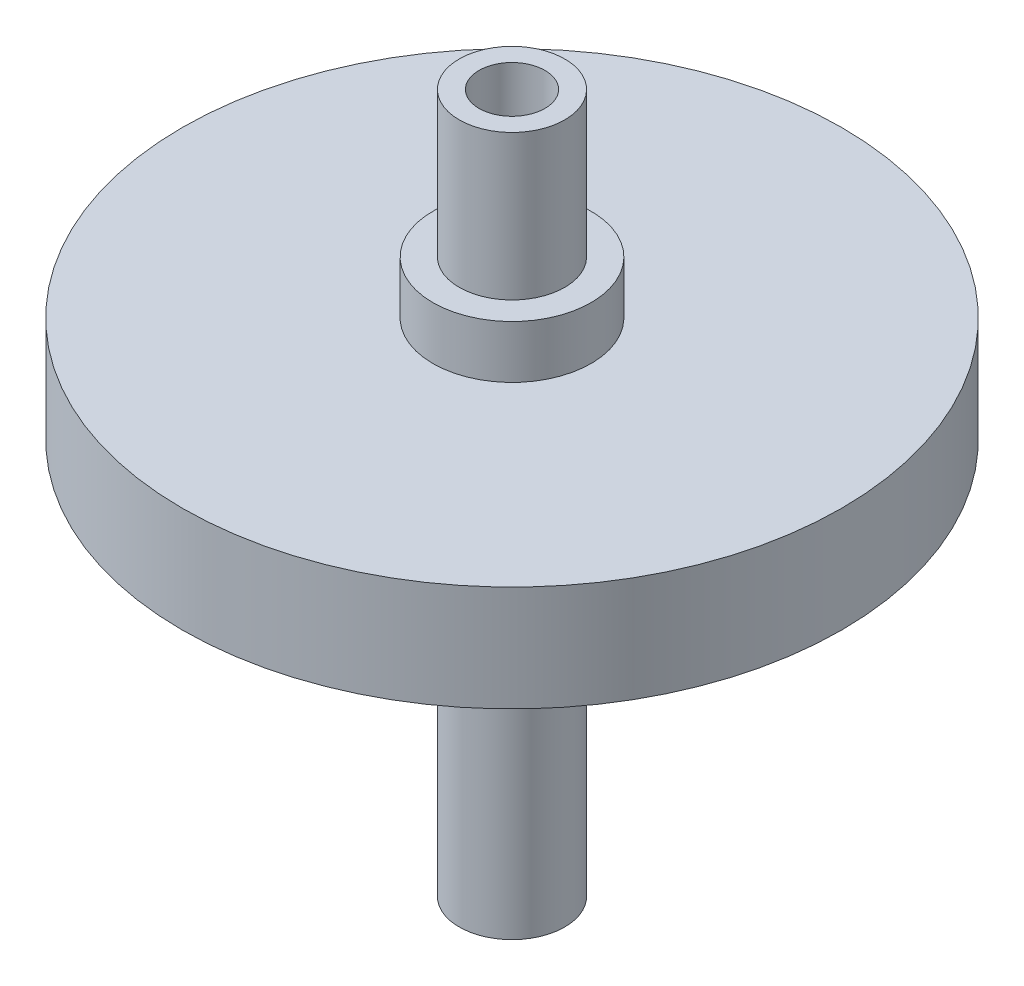
ISO-10303-21;
HEADER;
FILE_DESCRIPTION(('STEP AP214'),'2;1');
FILE_NAME('part.step','',(''),(''),'','','');
FILE_SCHEMA(('AUTOMOTIVE_DESIGN { 1 0 10303 214 1 1 1 1 }'));
ENDSEC;
DATA;
#1=APPLICATION_CONTEXT('core data for automotive mechanical design processes');
#2=APPLICATION_PROTOCOL_DEFINITION('international standard','automotive_design',2000,#1);
#3=PRODUCT_CONTEXT('',#1,'mechanical');
#4=PRODUCT('Part','Part','',(#3));
#5=PRODUCT_RELATED_PRODUCT_CATEGORY('part','',(#4));
#6=PRODUCT_DEFINITION_FORMATION('','',#4);
#7=PRODUCT_DEFINITION_CONTEXT('part definition',#1,'design');
#8=PRODUCT_DEFINITION('design','',#6,#7);
#9=PRODUCT_DEFINITION_SHAPE('','',#8);
#10=(LENGTH_UNIT() NAMED_UNIT(*) SI_UNIT(.MILLI.,.METRE.));
#11=(NAMED_UNIT(*) PLANE_ANGLE_UNIT() SI_UNIT($,.RADIAN.));
#12=(NAMED_UNIT(*) SI_UNIT($,.STERADIAN.) SOLID_ANGLE_UNIT());
#13=UNCERTAINTY_MEASURE_WITH_UNIT(LENGTH_MEASURE(1.E-05),#10,'distance_accuracy_value','');
#14=(GEOMETRIC_REPRESENTATION_CONTEXT(3) GLOBAL_UNCERTAINTY_ASSIGNED_CONTEXT((#13)) GLOBAL_UNIT_ASSIGNED_CONTEXT((#10,
#11,#12)) REPRESENTATION_CONTEXT('',''));
#15=CARTESIAN_POINT('',(0.,0.,0.));
#16=DIRECTION('',(0.,0.,1.));
#17=DIRECTION('',(1.,0.,0.));
#18=AXIS2_PLACEMENT_3D('',#15,#16,#17);
#19=CARTESIAN_POINT('',(0.,8.,0.));
#20=DIRECTION('',(0.,-1.,0.));
#21=DIRECTION('',(0.,0.,-1.));
#22=AXIS2_PLACEMENT_3D('',#19,#20,#21);
#23=CYLINDRICAL_SURFACE('',#22,25.);
#24=CARTESIAN_POINT('',(0.,8.,0.));
#25=DIRECTION('',(0.,1.,0.));
#26=DIRECTION('',(0.,0.,1.));
#27=AXIS2_PLACEMENT_3D('',#24,#25,#26);
#28=CIRCLE('',#27,25.);
#29=CARTESIAN_POINT('',(0.,8.,25.));
#30=VERTEX_POINT('',#29);
#31=EDGE_CURVE('E76',#30,#30,#28,.T.);
#32=ORIENTED_EDGE('',*,*,#31,.F.);
#33=EDGE_LOOP('',(#32));
#34=FACE_BOUND('',#33,.T.);
#35=CARTESIAN_POINT('',(0.,0.,0.));
#36=DIRECTION('',(0.,1.,0.));
#37=DIRECTION('',(0.,0.,1.));
#38=AXIS2_PLACEMENT_3D('',#35,#36,#37);
#39=CIRCLE('',#38,25.);
#40=CARTESIAN_POINT('',(0.,0.,25.));
#41=VERTEX_POINT('',#40);
#42=EDGE_CURVE('E75',#41,#41,#39,.T.);
#43=ORIENTED_EDGE('',*,*,#42,.T.);
#44=EDGE_LOOP('',(#43));
#45=FACE_BOUND('',#44,.T.);
#46=ADVANCED_FACE('F35',(#34,#45),#23,.T.);
#47=CARTESIAN_POINT('',(0.,8.,0.));
#48=DIRECTION('',(0.,1.,0.));
#49=DIRECTION('',(0.,0.,1.));
#50=AXIS2_PLACEMENT_3D('',#47,#48,#49);
#51=PLANE('',#50);
#52=CARTESIAN_POINT('',(0.,8.,0.));
#53=DIRECTION('',(0.,1.,0.));
#54=DIRECTION('',(0.,0.,1.));
#55=AXIS2_PLACEMENT_3D('',#52,#53,#54);
#56=CIRCLE('',#55,6.);
#57=CARTESIAN_POINT('',(0.,8.,6.));
#58=VERTEX_POINT('',#57);
#59=EDGE_CURVE('E51',#58,#58,#56,.T.);
#60=ORIENTED_EDGE('',*,*,#59,.F.);
#61=EDGE_LOOP('',(#60));
#62=FACE_BOUND('',#61,.T.);
#63=ORIENTED_EDGE('',*,*,#31,.T.);
#64=EDGE_LOOP('',(#63));
#65=FACE_BOUND('',#64,.T.);
#66=ADVANCED_FACE('F113',(#62,#65),#51,.T.);
#67=CARTESIAN_POINT('',(0.,0.,0.));
#68=DIRECTION('',(0.,1.,0.));
#69=DIRECTION('',(0.,0.,1.));
#70=AXIS2_PLACEMENT_3D('',#67,#68,#69);
#71=PLANE('',#70);
#72=CARTESIAN_POINT('',(0.,0.,0.));
#73=DIRECTION('',(0.,1.,0.));
#74=DIRECTION('',(0.,0.,1.));
#75=AXIS2_PLACEMENT_3D('',#72,#73,#74);
#76=CIRCLE('',#75,6.);
#77=CARTESIAN_POINT('',(0.,0.,6.));
#78=VERTEX_POINT('',#77);
#79=EDGE_CURVE('E43',#78,#78,#76,.F.);
#80=ORIENTED_EDGE('',*,*,#79,.F.);
#81=EDGE_LOOP('',(#80));
#82=FACE_BOUND('',#81,.T.);
#83=ORIENTED_EDGE('',*,*,#42,.F.);
#84=EDGE_LOOP('',(#83));
#85=FACE_BOUND('',#84,.T.);
#86=ADVANCED_FACE('F110',(#82,#85),#71,.F.);
#87=CARTESIAN_POINT('',(0.,-4.,0.));
#88=DIRECTION('',(0.,-1.,0.));
#89=DIRECTION('',(0.,0.,-1.));
#90=AXIS2_PLACEMENT_3D('',#87,#88,#89);
#91=PLANE('',#90);
#92=CARTESIAN_POINT('',(0.,-4.,0.));
#93=DIRECTION('',(0.,-1.,0.));
#94=DIRECTION('',(0.,0.,-1.));
#95=AXIS2_PLACEMENT_3D('',#92,#93,#94);
#96=CIRCLE('',#95,6.);
#97=CARTESIAN_POINT('',(0.,-4.,-6.));
#98=VERTEX_POINT('',#97);
#99=EDGE_CURVE('E56',#98,#98,#96,.T.);
#100=ORIENTED_EDGE('',*,*,#99,.T.);
#101=EDGE_LOOP('',(#100));
#102=FACE_BOUND('',#101,.T.);
#103=CARTESIAN_POINT('',(0.,-4.,0.));
#104=DIRECTION('',(0.,-1.,0.));
#105=DIRECTION('',(0.,0.,-1.));
#106=AXIS2_PLACEMENT_3D('',#103,#104,#105);
#107=CIRCLE('',#106,4.);
#108=CARTESIAN_POINT('',(0.,-4.,-4.));
#109=VERTEX_POINT('',#108);
#110=EDGE_CURVE('E60',#109,#109,#107,.T.);
#111=ORIENTED_EDGE('',*,*,#110,.F.);
#112=EDGE_LOOP('',(#111));
#113=FACE_BOUND('',#112,.T.);
#114=ADVANCED_FACE('F93',(#102,#113),#91,.T.);
#115=CARTESIAN_POINT('',(0.,-4.,0.));
#116=DIRECTION('',(0.,1.,0.));
#117=DIRECTION('',(0.,0.,1.));
#118=AXIS2_PLACEMENT_3D('',#115,#116,#117);
#119=CYLINDRICAL_SURFACE('',#118,6.);
#120=ORIENTED_EDGE('',*,*,#99,.F.);
#121=EDGE_LOOP('',(#120));
#122=FACE_BOUND('',#121,.T.);
#123=ORIENTED_EDGE('',*,*,#79,.T.);
#124=EDGE_LOOP('',(#123));
#125=FACE_BOUND('',#124,.T.);
#126=ADVANCED_FACE('F109',(#122,#125),#119,.T.);
#127=CARTESIAN_POINT('',(0.,-30.,0.));
#128=DIRECTION('',(0.,1.,0.));
#129=DIRECTION('',(0.,0.,1.));
#130=AXIS2_PLACEMENT_3D('',#127,#128,#129);
#131=CYLINDRICAL_SURFACE('',#130,4.);
#132=ORIENTED_EDGE('',*,*,#110,.T.);
#133=EDGE_LOOP('',(#132));
#134=FACE_BOUND('',#133,.T.);
#135=CARTESIAN_POINT('',(0.,-30.,0.));
#136=DIRECTION('',(0.,-1.,0.));
#137=DIRECTION('',(0.,0.,-1.));
#138=AXIS2_PLACEMENT_3D('',#135,#136,#137);
#139=CIRCLE('',#138,4.);
#140=CARTESIAN_POINT('',(0.,-30.,-4.));
#141=VERTEX_POINT('',#140);
#142=EDGE_CURVE('E69',#141,#141,#139,.T.);
#143=ORIENTED_EDGE('',*,*,#142,.F.);
#144=EDGE_LOOP('',(#143));
#145=FACE_BOUND('',#144,.T.);
#146=ADVANCED_FACE('F138',(#134,#145),#131,.T.);
#147=CARTESIAN_POINT('',(0.,-30.,0.));
#148=DIRECTION('',(0.,-1.,0.));
#149=DIRECTION('',(0.,0.,-1.));
#150=AXIS2_PLACEMENT_3D('',#147,#148,#149);
#151=PLANE('',#150);
#152=CARTESIAN_POINT('',(0.,-30.,0.));
#153=DIRECTION('',(0.,1.,0.));
#154=DIRECTION('',(0.,0.,1.));
#155=AXIS2_PLACEMENT_3D('',#152,#153,#154);
#156=CIRCLE('',#155,2.5);
#157=CARTESIAN_POINT('',(0.,-30.,2.5));
#158=VERTEX_POINT('',#157);
#159=EDGE_CURVE('E63',#158,#158,#156,.T.);
#160=ORIENTED_EDGE('',*,*,#159,.T.);
#161=EDGE_LOOP('',(#160));
#162=FACE_BOUND('',#161,.T.);
#163=ORIENTED_EDGE('',*,*,#142,.T.);
#164=EDGE_LOOP('',(#163));
#165=FACE_BOUND('',#164,.T.);
#166=ADVANCED_FACE('F102',(#162,#165),#151,.T.);
#167=CARTESIAN_POINT('',(0.,-30.,0.));
#168=DIRECTION('',(0.,1.,0.));
#169=DIRECTION('',(0.,0.,1.));
#170=AXIS2_PLACEMENT_3D('',#167,#168,#169);
#171=CYLINDRICAL_SURFACE('',#170,2.5);
#172=CARTESIAN_POINT('',(0.,-4.,0.));
#173=DIRECTION('',(0.,-1.,0.));
#174=DIRECTION('',(0.,0.,-1.));
#175=AXIS2_PLACEMENT_3D('',#172,#173,#174);
#176=CIRCLE('',#175,2.5);
#177=CARTESIAN_POINT('',(0.,-4.,-2.5));
#178=VERTEX_POINT('',#177);
#179=EDGE_CURVE('E59',#178,#178,#176,.F.);
#180=ORIENTED_EDGE('',*,*,#179,.T.);
#181=EDGE_LOOP('',(#180));
#182=FACE_BOUND('',#181,.T.);
#183=ORIENTED_EDGE('',*,*,#159,.F.);
#184=EDGE_LOOP('',(#183));
#185=FACE_BOUND('',#184,.T.);
#186=ADVANCED_FACE('F86',(#182,#185),#171,.F.);
#187=ORIENTED_EDGE('',*,*,#179,.F.);
#188=EDGE_LOOP('',(#187));
#189=FACE_BOUND('',#188,.T.);
#190=ADVANCED_FACE('F89',(#189),#91,.T.);
#191=CARTESIAN_POINT('',(0.,12.,0.));
#192=DIRECTION('',(0.,1.,0.));
#193=DIRECTION('',(0.,0.,1.));
#194=AXIS2_PLACEMENT_3D('',#191,#192,#193);
#195=PLANE('',#194);
#196=CARTESIAN_POINT('',(0.,12.,0.));
#197=DIRECTION('',(0.,1.,0.));
#198=DIRECTION('',(0.,0.,1.));
#199=AXIS2_PLACEMENT_3D('',#196,#197,#198);
#200=CIRCLE('',#199,4.);
#201=CARTESIAN_POINT('',(0.,12.,4.));
#202=VERTEX_POINT('',#201);
#203=EDGE_CURVE('E38',#202,#202,#200,.T.);
#204=ORIENTED_EDGE('',*,*,#203,.F.);
#205=EDGE_LOOP('',(#204));
#206=FACE_BOUND('',#205,.T.);
#207=CARTESIAN_POINT('',(0.,12.,0.));
#208=DIRECTION('',(0.,1.,0.));
#209=DIRECTION('',(0.,0.,1.));
#210=AXIS2_PLACEMENT_3D('',#207,#208,#209);
#211=CIRCLE('',#210,6.);
#212=CARTESIAN_POINT('',(0.,12.,6.));
#213=VERTEX_POINT('',#212);
#214=EDGE_CURVE('E172',#213,#213,#211,.T.);
#215=ORIENTED_EDGE('',*,*,#214,.T.);
#216=EDGE_LOOP('',(#215));
#217=FACE_BOUND('',#216,.T.);
#218=ADVANCED_FACE('F91',(#206,#217),#195,.T.);
#219=CARTESIAN_POINT('',(0.,12.,0.));
#220=DIRECTION('',(0.,-1.,0.));
#221=DIRECTION('',(0.,0.,-1.));
#222=AXIS2_PLACEMENT_3D('',#219,#220,#221);
#223=CYLINDRICAL_SURFACE('',#222,6.);
#224=ORIENTED_EDGE('',*,*,#214,.F.);
#225=EDGE_LOOP('',(#224));
#226=FACE_BOUND('',#225,.T.);
#227=ORIENTED_EDGE('',*,*,#59,.T.);
#228=EDGE_LOOP('',(#227));
#229=FACE_BOUND('',#228,.T.);
#230=ADVANCED_FACE('F98',(#226,#229),#223,.T.);
#231=CARTESIAN_POINT('',(0.,12.,0.));
#232=DIRECTION('',(0.,1.,0.));
#233=DIRECTION('',(0.,0.,1.));
#234=AXIS2_PLACEMENT_3D('',#231,#232,#233);
#235=CIRCLE('',#234,2.5);
#236=CARTESIAN_POINT('',(0.,12.,2.5));
#237=VERTEX_POINT('',#236);
#238=EDGE_CURVE('E53',#237,#237,#235,.F.);
#239=ORIENTED_EDGE('',*,*,#238,.T.);
#240=EDGE_LOOP('',(#239));
#241=FACE_BOUND('',#240,.T.);
#242=CARTESIAN_POINT('',(0.,23.,0.));
#243=DIRECTION('',(0.,1.,0.));
#244=DIRECTION('',(0.,0.,1.));
#245=AXIS2_PLACEMENT_3D('',#242,#243,#244);
#246=CIRCLE('',#245,2.5);
#247=CARTESIAN_POINT('',(0.,23.,2.5));
#248=VERTEX_POINT('',#247);
#249=EDGE_CURVE('E66',#248,#248,#246,.T.);
#250=ORIENTED_EDGE('',*,*,#249,.T.);
#251=EDGE_LOOP('',(#250));
#252=FACE_BOUND('',#251,.T.);
#253=ADVANCED_FACE('F105',(#241,#252),#171,.F.);
#254=CARTESIAN_POINT('',(0.,23.,0.));
#255=DIRECTION('',(0.,1.,0.));
#256=DIRECTION('',(0.,0.,1.));
#257=AXIS2_PLACEMENT_3D('',#254,#255,#256);
#258=PLANE('',#257);
#259=ORIENTED_EDGE('',*,*,#249,.F.);
#260=EDGE_LOOP('',(#259));
#261=FACE_BOUND('',#260,.T.);
#262=CARTESIAN_POINT('',(0.,23.,0.));
#263=DIRECTION('',(0.,1.,0.));
#264=DIRECTION('',(0.,0.,1.));
#265=AXIS2_PLACEMENT_3D('',#262,#263,#264);
#266=CIRCLE('',#265,4.);
#267=CARTESIAN_POINT('',(0.,23.,4.));
#268=VERTEX_POINT('',#267);
#269=EDGE_CURVE('E72',#268,#268,#266,.T.);
#270=ORIENTED_EDGE('',*,*,#269,.T.);
#271=EDGE_LOOP('',(#270));
#272=FACE_BOUND('',#271,.T.);
#273=ADVANCED_FACE('F133',(#261,#272),#258,.T.);
#274=CARTESIAN_POINT('',(0.,23.,0.));
#275=DIRECTION('',(0.,-1.,0.));
#276=DIRECTION('',(0.,0.,-1.));
#277=AXIS2_PLACEMENT_3D('',#274,#275,#276);
#278=CYLINDRICAL_SURFACE('',#277,4.);
#279=ORIENTED_EDGE('',*,*,#203,.T.);
#280=EDGE_LOOP('',(#279));
#281=FACE_BOUND('',#280,.T.);
#282=ORIENTED_EDGE('',*,*,#269,.F.);
#283=EDGE_LOOP('',(#282));
#284=FACE_BOUND('',#283,.T.);
#285=ADVANCED_FACE('F130',(#281,#284),#278,.T.);
#286=ORIENTED_EDGE('',*,*,#238,.F.);
#287=EDGE_LOOP('',(#286));
#288=FACE_BOUND('',#287,.T.);
#289=ADVANCED_FACE('F101',(#288),#195,.T.);
#290=CLOSED_SHELL('',(#46,#66,#86,#114,#126,#146,#166,#186,#190,#218,#230,#253,#273,#285,#289));
#291=CARTESIAN_POINT('',(0.,8.,0.));
#292=DIRECTION('',(0.,1.,0.));
#293=DIRECTION('',(0.,0.,1.));
#294=AXIS2_PLACEMENT_3D('',#291,#292,#293);
#295=PLANE('',#294);
#296=CARTESIAN_POINT('',(0.,8.,0.));
#297=DIRECTION('',(0.,1.,0.));
#298=DIRECTION('',(0.,0.,1.));
#299=AXIS2_PLACEMENT_3D('',#296,#297,#298);
#300=CIRCLE('',#299,2.5);
#301=CARTESIAN_POINT('',(0.,8.,2.5));
#302=VERTEX_POINT('',#301);
#303=EDGE_CURVE('E10',#302,#302,#300,.F.);
#304=ORIENTED_EDGE('',*,*,#303,.T.);
#305=EDGE_LOOP('',(#304));
#306=FACE_BOUND('',#305,.T.);
#307=ADVANCED_FACE('F149',(#306),#295,.F.);
#308=CARTESIAN_POINT('',(0.,0.,0.));
#309=DIRECTION('',(0.,-1.,0.));
#310=DIRECTION('',(0.,0.,-1.));
#311=AXIS2_PLACEMENT_3D('',#308,#309,#310);
#312=PLANE('',#311);
#313=CARTESIAN_POINT('',(0.,0.,0.));
#314=DIRECTION('',(0.,-1.,0.));
#315=DIRECTION('',(0.,0.,-1.));
#316=AXIS2_PLACEMENT_3D('',#313,#314,#315);
#317=CIRCLE('',#316,2.5);
#318=CARTESIAN_POINT('',(0.,0.,-2.5));
#319=VERTEX_POINT('',#318);
#320=EDGE_CURVE('E48',#319,#319,#317,.F.);
#321=ORIENTED_EDGE('',*,*,#320,.T.);
#322=EDGE_LOOP('',(#321));
#323=FACE_BOUND('',#322,.T.);
#324=ADVANCED_FACE('F147',(#323),#312,.F.);
#325=ORIENTED_EDGE('',*,*,#320,.F.);
#326=EDGE_LOOP('',(#325));
#327=FACE_BOUND('',#326,.T.);
#328=ORIENTED_EDGE('',*,*,#303,.F.);
#329=EDGE_LOOP('',(#328));
#330=FACE_BOUND('',#329,.T.);
#331=ADVANCED_FACE('F104',(#327,#330),#171,.F.);
#332=CLOSED_SHELL('',(#307,#324,#331));
#333=ORIENTED_CLOSED_SHELL('',*,#332,.T.);
#334=BREP_WITH_VOIDS('B2',#290,(#333));
#335=ADVANCED_BREP_SHAPE_REPRESENTATION('',(#18,#334),#14);
#336=SHAPE_DEFINITION_REPRESENTATION(#9,#335);
ENDSEC;
END-ISO-10303-21;
